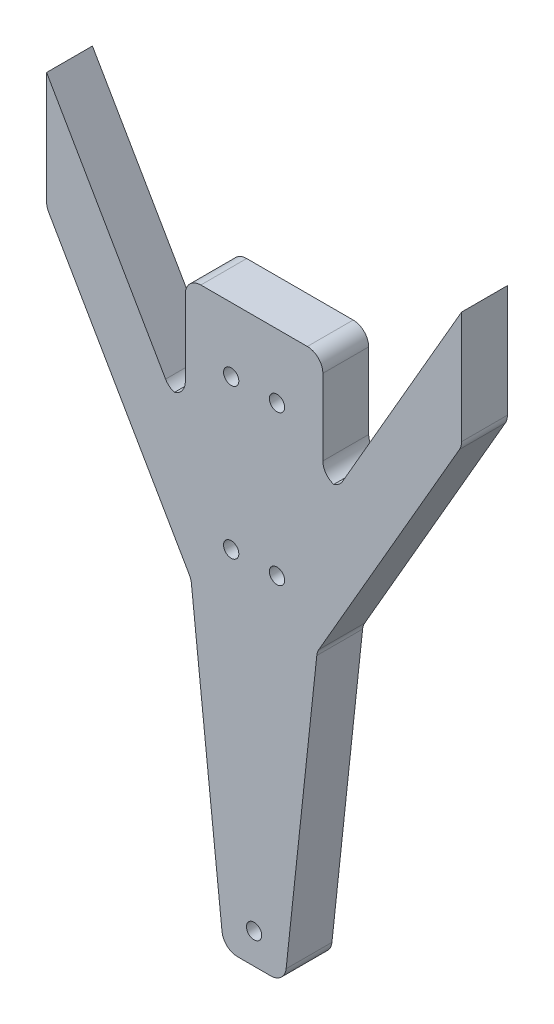
ISO-10303-21;
HEADER;
FILE_DESCRIPTION(('STEP AP214'),'2;1');
FILE_NAME('part.step','',(''),(''),'','','');
FILE_SCHEMA(('AUTOMOTIVE_DESIGN { 1 0 10303 214 1 1 1 1 }'));
ENDSEC;
DATA;
#1=APPLICATION_CONTEXT('core data for automotive mechanical design processes');
#2=APPLICATION_PROTOCOL_DEFINITION('international standard','automotive_design',2000,#1);
#3=PRODUCT_CONTEXT('',#1,'mechanical');
#4=PRODUCT('Part','Part','',(#3));
#5=PRODUCT_RELATED_PRODUCT_CATEGORY('part','',(#4));
#6=PRODUCT_DEFINITION_FORMATION('','',#4);
#7=PRODUCT_DEFINITION_CONTEXT('part definition',#1,'design');
#8=PRODUCT_DEFINITION('design','',#6,#7);
#9=PRODUCT_DEFINITION_SHAPE('','',#8);
#10=(LENGTH_UNIT() NAMED_UNIT(*) SI_UNIT(.MILLI.,.METRE.));
#11=(NAMED_UNIT(*) PLANE_ANGLE_UNIT() SI_UNIT($,.RADIAN.));
#12=(NAMED_UNIT(*) SI_UNIT($,.STERADIAN.) SOLID_ANGLE_UNIT());
#13=UNCERTAINTY_MEASURE_WITH_UNIT(LENGTH_MEASURE(1.E-05),#10,'distance_accuracy_value','');
#14=(GEOMETRIC_REPRESENTATION_CONTEXT(3) GLOBAL_UNCERTAINTY_ASSIGNED_CONTEXT((#13)) GLOBAL_UNIT_ASSIGNED_CONTEXT((#10,
#11,#12)) REPRESENTATION_CONTEXT('',''));
#15=CARTESIAN_POINT('',(0.,0.,0.));
#16=DIRECTION('',(0.,0.,1.));
#17=DIRECTION('',(1.,0.,0.));
#18=AXIS2_PLACEMENT_3D('',#15,#16,#17);
#19=CARTESIAN_POINT('',(7.50000000000001,64.,0.));
#20=DIRECTION('',(0.,0.,-1.));
#21=DIRECTION('',(-1.,0.,0.));
#22=AXIS2_PLACEMENT_3D('',#19,#20,#21);
#23=CYLINDRICAL_SURFACE('',#22,2.5);
#24=CARTESIAN_POINT('',(7.50000000000001,64.,15.));
#25=DIRECTION('',(0.,0.,-1.));
#26=DIRECTION('',(-1.,0.,0.));
#27=AXIS2_PLACEMENT_3D('',#24,#25,#26);
#28=CIRCLE('',#27,2.5);
#29=CARTESIAN_POINT('',(5.00000000000002,64.,15.));
#30=VERTEX_POINT('',#29);
#31=EDGE_CURVE('E501',#30,#30,#28,.T.);
#32=ORIENTED_EDGE('',*,*,#31,.F.);
#33=EDGE_LOOP('',(#32));
#34=FACE_BOUND('',#33,.T.);
#35=CARTESIAN_POINT('',(7.50000000000001,64.,5.));
#36=DIRECTION('',(0.,0.,-1.));
#37=DIRECTION('',(-1.,0.,0.));
#38=AXIS2_PLACEMENT_3D('',#35,#36,#37);
#39=CIRCLE('',#38,2.5);
#40=CARTESIAN_POINT('',(5.00000000000002,64.,5.));
#41=VERTEX_POINT('',#40);
#42=EDGE_CURVE('E45',#41,#41,#39,.F.);
#43=ORIENTED_EDGE('',*,*,#42,.F.);
#44=EDGE_LOOP('',(#43));
#45=FACE_BOUND('',#44,.T.);
#46=ADVANCED_FACE('F41',(#34,#45),#23,.F.);
#47=CARTESIAN_POINT('',(-7.49999999999998,64.,0.));
#48=DIRECTION('',(0.,0.,-1.));
#49=DIRECTION('',(-1.,0.,0.));
#50=AXIS2_PLACEMENT_3D('',#47,#48,#49);
#51=CYLINDRICAL_SURFACE('',#50,2.5);
#52=CARTESIAN_POINT('',(-7.49999999999998,64.,15.));
#53=DIRECTION('',(0.,0.,-1.));
#54=DIRECTION('',(-1.,0.,0.));
#55=AXIS2_PLACEMENT_3D('',#52,#53,#54);
#56=CIRCLE('',#55,2.5);
#57=CARTESIAN_POINT('',(-9.99999999999998,64.,15.));
#58=VERTEX_POINT('',#57);
#59=EDGE_CURVE('E480',#58,#58,#56,.T.);
#60=ORIENTED_EDGE('',*,*,#59,.F.);
#61=EDGE_LOOP('',(#60));
#62=FACE_BOUND('',#61,.T.);
#63=CARTESIAN_POINT('',(-7.49999999999998,64.,5.));
#64=DIRECTION('',(0.,0.,-1.));
#65=DIRECTION('',(-1.,0.,0.));
#66=AXIS2_PLACEMENT_3D('',#63,#64,#65);
#67=CIRCLE('',#66,2.5);
#68=CARTESIAN_POINT('',(-9.99999999999998,64.,5.));
#69=VERTEX_POINT('',#68);
#70=EDGE_CURVE('E471',#69,#69,#67,.F.);
#71=ORIENTED_EDGE('',*,*,#70,.F.);
#72=EDGE_LOOP('',(#71));
#73=FACE_BOUND('',#72,.T.);
#74=ADVANCED_FACE('F561',(#62,#73),#51,.F.);
#75=CARTESIAN_POINT('',(0.,0.,15.));
#76=DIRECTION('',(0.,0.,1.));
#77=DIRECTION('',(1.,0.,0.));
#78=AXIS2_PLACEMENT_3D('',#75,#76,#77);
#79=PLANE('',#78);
#80=DIRECTION('',(-1.,0.,0.));
#81=VECTOR('',#80,1.);
#82=CARTESIAN_POINT('',(-22.5104682033564,85.0000000000001,15.));
#83=LINE('',#82,#81);
#84=CARTESIAN_POINT('',(17.4304682033558,85.0000000000001,15.));
#85=VERTEX_POINT('',#84);
#86=CARTESIAN_POINT('',(-17.4304682033564,85.0000000000001,15.));
#87=VERTEX_POINT('',#86);
#88=EDGE_CURVE('E269',#85,#87,#83,.T.);
#89=ORIENTED_EDGE('',*,*,#88,.T.);
#90=CARTESIAN_POINT('',(-17.4304682033564,79.9200000000001,15.));
#91=DIRECTION('',(0.,0.,1.));
#92=DIRECTION('',(1.,0.,0.));
#93=AXIS2_PLACEMENT_3D('',#90,#91,#92);
#94=CIRCLE('',#93,5.08);
#95=CARTESIAN_POINT('',(-22.5104682033564,79.9200000000001,15.));
#96=VERTEX_POINT('',#95);
#97=EDGE_CURVE('E381',#87,#96,#94,.T.);
#98=ORIENTED_EDGE('',*,*,#97,.T.);
#99=DIRECTION('',(0.,-1.,0.));
#100=VECTOR('',#99,1.);
#101=CARTESIAN_POINT('',(-22.5104682033564,50.0000000000001,15.));
#102=LINE('',#101,#100);
#103=CARTESIAN_POINT('',(-22.5104682033564,55.0800000000001,15.));
#104=VERTEX_POINT('',#103);
#105=EDGE_CURVE('E272',#96,#104,#102,.T.);
#106=ORIENTED_EDGE('',*,*,#105,.T.);
#107=CARTESIAN_POINT('',(-27.5904682033564,55.0800000000001,15.));
#108=DIRECTION('',(0.,0.,1.));
#109=DIRECTION('',(1.,0.,0.));
#110=AXIS2_PLACEMENT_3D('',#107,#108,#109);
#111=CIRCLE('',#110,5.08);
#112=CARTESIAN_POINT('',(-26.0839985196147,50.2285106315724,15.));
#113=VERTEX_POINT('',#112);
#114=EDGE_CURVE('E59',#104,#113,#111,.F.);
#115=ORIENTED_EDGE('',*,*,#114,.T.);
#116=CARTESIAN_POINT('',(-24.5775288358731,55.0800000000001,15.));
#117=DIRECTION('',(0.,0.,1.));
#118=DIRECTION('',(1.,0.,0.));
#119=AXIS2_PLACEMENT_3D('',#116,#117,#118);
#120=CIRCLE('',#119,5.08);
#121=CARTESIAN_POINT('',(-28.976937887098,52.5400000000001,15.));
#122=VERTEX_POINT('',#121);
#123=EDGE_CURVE('E213',#113,#122,#120,.F.);
#124=ORIENTED_EDGE('',*,*,#123,.T.);
#125=DIRECTION('',(-0.500000000000004,0.866025403784436,0.));
#126=VECTOR('',#125,1.);
#127=CARTESIAN_POINT('',(-67.9249870466306,120.,15.));
#128=LINE('',#127,#126);
#129=CARTESIAN_POINT('',(-67.9249870466306,120.,15.));
#130=VERTEX_POINT('',#129);
#131=EDGE_CURVE('E204',#122,#130,#128,.T.);
#132=ORIENTED_EDGE('',*,*,#131,.T.);
#133=DIRECTION('',(0.,-1.,0.));
#134=VECTOR('',#133,1.);
#135=CARTESIAN_POINT('',(-67.9249870466306,120.,15.));
#136=LINE('',#135,#134);
#137=CARTESIAN_POINT('',(-67.9249870466306,83.261181897551,15.));
#138=VERTEX_POINT('',#137);
#139=EDGE_CURVE('E210',#130,#138,#136,.T.);
#140=ORIENTED_EDGE('',*,*,#139,.T.);
#141=CARTESIAN_POINT('',(-62.8449870466306,83.261181897551,15.));
#142=DIRECTION('',(0.,0.,1.));
#143=DIRECTION('',(1.,0.,0.));
#144=AXIS2_PLACEMENT_3D('',#141,#142,#143);
#145=CIRCLE('',#144,5.08);
#146=CARTESIAN_POINT('',(-67.2443960978555,80.721181897551,15.));
#147=VERTEX_POINT('',#146);
#148=EDGE_CURVE('E372',#138,#147,#145,.T.);
#149=ORIENTED_EDGE('',*,*,#148,.T.);
#150=DIRECTION('',(0.500000000000004,-0.866025403784436,0.));
#151=VECTOR('',#150,1.);
#152=CARTESIAN_POINT('',(-20.6399999999992,0.,15.));
#153=LINE('',#152,#151);
#154=CARTESIAN_POINT('',(-21.1773959945488,0.930797166343919,15.));
#155=VERTEX_POINT('',#154);
#156=EDGE_CURVE('E235',#147,#155,#153,.T.);
#157=ORIENTED_EDGE('',*,*,#156,.T.);
#158=CARTESIAN_POINT('',(-25.5768050457737,-1.60920283365611,15.));
#159=DIRECTION('',(0.,0.,1.));
#160=DIRECTION('',(1.,0.,0.));
#161=AXIS2_PLACEMENT_3D('',#158,#159,#160);
#162=CIRCLE('',#161,5.08);
#163=CARTESIAN_POINT('',(-20.525642132359,-1.06869083365617,15.));
#164=VERTEX_POINT('',#163);
#165=EDGE_CURVE('E11',#155,#164,#162,.F.);
#166=ORIENTED_EDGE('',*,*,#165,.T.);
#167=DIRECTION('',(0.106399999999992,-0.994323408152499,0.));
#168=VECTOR('',#167,1.);
#169=CARTESIAN_POINT('',(-10.,-99.4323408152499,15.));
#170=LINE('',#169,#168);
#171=CARTESIAN_POINT('',(-10.4857589786581,-94.8928528152499,15.));
#172=VERTEX_POINT('',#171);
#173=EDGE_CURVE('E239',#164,#172,#170,.T.);
#174=ORIENTED_EDGE('',*,*,#173,.T.);
#175=CARTESIAN_POINT('',(-5.43459606524337,-94.3523408152499,15.));
#176=DIRECTION('',(0.,0.,1.));
#177=DIRECTION('',(1.,0.,0.));
#178=AXIS2_PLACEMENT_3D('',#175,#176,#177);
#179=CIRCLE('',#178,5.08);
#180=CARTESIAN_POINT('',(-5.43459606524337,-99.4323408152499,15.));
#181=VERTEX_POINT('',#180);
#182=EDGE_CURVE('E369',#172,#181,#179,.T.);
#183=ORIENTED_EDGE('',*,*,#182,.T.);
#184=DIRECTION('',(1.,0.,0.));
#185=VECTOR('',#184,1.);
#186=CARTESIAN_POINT('',(10.,-99.4323408152499,15.));
#187=LINE('',#186,#185);
#188=CARTESIAN_POINT('',(5.43459606524337,-99.4323408152499,15.));
#189=VERTEX_POINT('',#188);
#190=EDGE_CURVE('E246',#181,#189,#187,.T.);
#191=ORIENTED_EDGE('',*,*,#190,.T.);
#192=CARTESIAN_POINT('',(5.43459606524337,-94.3523408152499,15.));
#193=DIRECTION('',(0.,0.,1.));
#194=DIRECTION('',(1.,0.,0.));
#195=AXIS2_PLACEMENT_3D('',#192,#193,#194);
#196=CIRCLE('',#195,5.08);
#197=CARTESIAN_POINT('',(10.4857589786581,-94.8928528152499,15.));
#198=VERTEX_POINT('',#197);
#199=EDGE_CURVE('E366',#189,#198,#196,.T.);
#200=ORIENTED_EDGE('',*,*,#199,.T.);
#201=DIRECTION('',(0.106399999999992,0.994323408152499,0.));
#202=VECTOR('',#201,1.);
#203=CARTESIAN_POINT('',(20.6399999999992,0.,15.));
#204=LINE('',#203,#202);
#205=CARTESIAN_POINT('',(20.5256421323591,-1.06869083365608,15.));
#206=VERTEX_POINT('',#205);
#207=EDGE_CURVE('E250',#198,#206,#204,.T.);
#208=ORIENTED_EDGE('',*,*,#207,.T.);
#209=CARTESIAN_POINT('',(25.5768050457738,-1.60920283365604,15.));
#210=DIRECTION('',(0.,0.,1.));
#211=DIRECTION('',(1.,0.,0.));
#212=AXIS2_PLACEMENT_3D('',#209,#210,#211);
#213=CIRCLE('',#212,5.08);
#214=CARTESIAN_POINT('',(21.1773959945488,0.93079716634395,15.));
#215=VERTEX_POINT('',#214);
#216=EDGE_CURVE('E449',#206,#215,#213,.F.);
#217=ORIENTED_EDGE('',*,*,#216,.T.);
#218=DIRECTION('',(0.499999999999998,0.86602540378444,0.));
#219=VECTOR('',#218,1.);
#220=CARTESIAN_POINT('',(67.9249870466299,81.9000000000008,15.));
#221=LINE('',#220,#219);
#222=CARTESIAN_POINT('',(67.2443960978548,80.7211818975509,15.));
#223=VERTEX_POINT('',#222);
#224=EDGE_CURVE('E254',#215,#223,#221,.T.);
#225=ORIENTED_EDGE('',*,*,#224,.T.);
#226=CARTESIAN_POINT('',(62.8449870466298,83.2611818975509,15.));
#227=DIRECTION('',(0.,0.,1.));
#228=DIRECTION('',(1.,0.,0.));
#229=AXIS2_PLACEMENT_3D('',#226,#227,#228);
#230=CIRCLE('',#229,5.08);
#231=CARTESIAN_POINT('',(67.9249870466299,83.2611818975509,15.));
#232=VERTEX_POINT('',#231);
#233=EDGE_CURVE('E375',#223,#232,#230,.T.);
#234=ORIENTED_EDGE('',*,*,#233,.T.);
#235=DIRECTION('',(0.,1.,0.));
#236=VECTOR('',#235,1.);
#237=CARTESIAN_POINT('',(67.9249870466299,120.,15.));
#238=LINE('',#237,#236);
#239=CARTESIAN_POINT('',(67.9249870466299,120.,15.));
#240=VERTEX_POINT('',#239);
#241=EDGE_CURVE('E258',#232,#240,#238,.T.);
#242=ORIENTED_EDGE('',*,*,#241,.T.);
#243=DIRECTION('',(-0.499999999999999,-0.866025403784439,0.));
#244=VECTOR('',#243,1.);
#245=CARTESIAN_POINT('',(27.5104682033558,49.9999999999993,15.));
#246=LINE('',#245,#244);
#247=CARTESIAN_POINT('',(28.9769378870974,52.5399999999993,15.));
#248=VERTEX_POINT('',#247);
#249=EDGE_CURVE('E261',#240,#248,#246,.T.);
#250=ORIENTED_EDGE('',*,*,#249,.T.);
#251=CARTESIAN_POINT('',(24.5775288358725,55.0799999999993,15.));
#252=DIRECTION('',(0.,0.,1.));
#253=DIRECTION('',(1.,0.,0.));
#254=AXIS2_PLACEMENT_3D('',#251,#252,#253);
#255=CIRCLE('',#254,5.08);
#256=CARTESIAN_POINT('',(26.0839985196141,50.2285106315716,15.));
#257=VERTEX_POINT('',#256);
#258=EDGE_CURVE('E428',#248,#257,#255,.F.);
#259=ORIENTED_EDGE('',*,*,#258,.T.);
#260=CARTESIAN_POINT('',(27.5904682033558,55.0799999999993,15.));
#261=DIRECTION('',(0.,0.,1.));
#262=DIRECTION('',(1.,0.,0.));
#263=AXIS2_PLACEMENT_3D('',#260,#261,#262);
#264=CIRCLE('',#263,5.08);
#265=CARTESIAN_POINT('',(22.5104682033558,55.0799999999993,15.));
#266=VERTEX_POINT('',#265);
#267=EDGE_CURVE('E434',#257,#266,#264,.F.);
#268=ORIENTED_EDGE('',*,*,#267,.T.);
#269=DIRECTION('',(0.,1.,0.));
#270=VECTOR('',#269,1.);
#271=CARTESIAN_POINT('',(22.5104682033558,85.0000000000001,15.));
#272=LINE('',#271,#270);
#273=CARTESIAN_POINT('',(22.5104682033558,79.9200000000001,15.));
#274=VERTEX_POINT('',#273);
#275=EDGE_CURVE('E265',#266,#274,#272,.T.);
#276=ORIENTED_EDGE('',*,*,#275,.T.);
#277=CARTESIAN_POINT('',(17.4304682033558,79.9200000000001,15.));
#278=DIRECTION('',(0.,0.,1.));
#279=DIRECTION('',(1.,0.,0.));
#280=AXIS2_PLACEMENT_3D('',#277,#278,#279);
#281=CIRCLE('',#280,5.08);
#282=EDGE_CURVE('E378',#274,#85,#281,.T.);
#283=ORIENTED_EDGE('',*,*,#282,.T.);
#284=EDGE_LOOP('',(#89,#98,#106,#115,#124,#132,#140,#149,#157,#166,#174,#183,#191,#200,#208,
#217,#225,#234,#242,#250,#259,#268,#276,#283));
#285=FACE_BOUND('',#284,.T.);
#286=CARTESIAN_POINT('',(7.5,15.,15.));
#287=DIRECTION('',(0.,0.,-1.));
#288=DIRECTION('',(-1.,0.,0.));
#289=AXIS2_PLACEMENT_3D('',#286,#287,#288);
#290=CIRCLE('',#289,2.5);
#291=CARTESIAN_POINT('',(5.,15.,15.));
#292=VERTEX_POINT('',#291);
#293=EDGE_CURVE('E461',#292,#292,#290,.T.);
#294=ORIENTED_EDGE('',*,*,#293,.T.);
#295=EDGE_LOOP('',(#294));
#296=FACE_BOUND('',#295,.T.);
#297=CARTESIAN_POINT('',(-7.5,15.,15.));
#298=DIRECTION('',(0.,0.,-1.));
#299=DIRECTION('',(-1.,0.,0.));
#300=AXIS2_PLACEMENT_3D('',#297,#298,#299);
#301=CIRCLE('',#300,2.5);
#302=CARTESIAN_POINT('',(-9.99999999999999,15.,15.));
#303=VERTEX_POINT('',#302);
#304=EDGE_CURVE('E470',#303,#303,#301,.T.);
#305=ORIENTED_EDGE('',*,*,#304,.T.);
#306=EDGE_LOOP('',(#305));
#307=FACE_BOUND('',#306,.T.);
#308=CARTESIAN_POINT('',(0.,-89.4323408152499,15.));
#309=DIRECTION('',(0.,0.,1.));
#310=DIRECTION('',(1.,0.,0.));
#311=AXIS2_PLACEMENT_3D('',#308,#309,#310);
#312=CIRCLE('',#311,2.5);
#313=CARTESIAN_POINT('',(2.5,-89.4323408152499,15.));
#314=VERTEX_POINT('',#313);
#315=EDGE_CURVE('E505',#314,#314,#312,.T.);
#316=ORIENTED_EDGE('',*,*,#315,.F.);
#317=EDGE_LOOP('',(#316));
#318=FACE_BOUND('',#317,.T.);
#319=ORIENTED_EDGE('',*,*,#31,.T.);
#320=EDGE_LOOP('',(#319));
#321=FACE_BOUND('',#320,.T.);
#322=ORIENTED_EDGE('',*,*,#59,.T.);
#323=EDGE_LOOP('',(#322));
#324=FACE_BOUND('',#323,.T.);
#325=ADVANCED_FACE('F207',(#285,#296,#307,#318,#321,#324),#79,.T.);
#326=CARTESIAN_POINT('',(0.,0.,0.));
#327=DIRECTION('',(0.,0.,1.));
#328=DIRECTION('',(1.,0.,0.));
#329=AXIS2_PLACEMENT_3D('',#326,#327,#328);
#330=PLANE('',#329);
#331=CARTESIAN_POINT('',(7.50000000000001,64.,0.));
#332=DIRECTION('',(0.,0.,-1.));
#333=DIRECTION('',(-1.,0.,0.));
#334=AXIS2_PLACEMENT_3D('',#331,#332,#333);
#335=CIRCLE('',#334,5.5);
#336=CARTESIAN_POINT('',(2.00000000000001,64.,0.));
#337=VERTEX_POINT('',#336);
#338=EDGE_CURVE('E482',#337,#337,#335,.T.);
#339=ORIENTED_EDGE('',*,*,#338,.F.);
#340=EDGE_LOOP('',(#339));
#341=FACE_BOUND('',#340,.T.);
#342=CARTESIAN_POINT('',(-7.49999999999998,64.,0.));
#343=DIRECTION('',(0.,0.,-1.));
#344=DIRECTION('',(-1.,0.,0.));
#345=AXIS2_PLACEMENT_3D('',#342,#343,#344);
#346=CIRCLE('',#345,5.5);
#347=CARTESIAN_POINT('',(-13.,64.,0.));
#348=VERTEX_POINT('',#347);
#349=EDGE_CURVE('E494',#348,#348,#346,.T.);
#350=ORIENTED_EDGE('',*,*,#349,.F.);
#351=EDGE_LOOP('',(#350));
#352=FACE_BOUND('',#351,.T.);
#353=CARTESIAN_POINT('',(0.,-89.4323408152499,0.));
#354=DIRECTION('',(0.,0.,1.));
#355=DIRECTION('',(1.,0.,0.));
#356=AXIS2_PLACEMENT_3D('',#353,#354,#355);
#357=CIRCLE('',#356,2.5);
#358=CARTESIAN_POINT('',(2.5,-89.4323408152499,0.));
#359=VERTEX_POINT('',#358);
#360=EDGE_CURVE('E506',#359,#359,#357,.T.);
#361=ORIENTED_EDGE('',*,*,#360,.T.);
#362=EDGE_LOOP('',(#361));
#363=FACE_BOUND('',#362,.T.);
#364=CARTESIAN_POINT('',(7.5,15.,0.));
#365=DIRECTION('',(0.,0.,-1.));
#366=DIRECTION('',(-1.,0.,0.));
#367=AXIS2_PLACEMENT_3D('',#364,#365,#366);
#368=CIRCLE('',#367,5.5);
#369=CARTESIAN_POINT('',(2.,15.,0.));
#370=VERTEX_POINT('',#369);
#371=EDGE_CURVE('E517',#370,#370,#368,.T.);
#372=ORIENTED_EDGE('',*,*,#371,.F.);
#373=EDGE_LOOP('',(#372));
#374=FACE_BOUND('',#373,.T.);
#375=CARTESIAN_POINT('',(-7.5,15.,0.));
#376=DIRECTION('',(0.,0.,-1.));
#377=DIRECTION('',(-1.,0.,0.));
#378=AXIS2_PLACEMENT_3D('',#375,#376,#377);
#379=CIRCLE('',#378,5.5);
#380=CARTESIAN_POINT('',(-13.,15.,0.));
#381=VERTEX_POINT('',#380);
#382=EDGE_CURVE('E510',#381,#381,#379,.T.);
#383=ORIENTED_EDGE('',*,*,#382,.F.);
#384=EDGE_LOOP('',(#383));
#385=FACE_BOUND('',#384,.T.);
#386=DIRECTION('',(0.,-1.,0.));
#387=VECTOR('',#386,1.);
#388=CARTESIAN_POINT('',(-22.5104682033564,50.0000000000001,0.));
#389=LINE('',#388,#387);
#390=CARTESIAN_POINT('',(-22.5104682033564,79.9200000000001,0.));
#391=VERTEX_POINT('',#390);
#392=CARTESIAN_POINT('',(-22.5104682033564,55.0800000000001,0.));
#393=VERTEX_POINT('',#392);
#394=EDGE_CURVE('E218',#391,#393,#389,.T.);
#395=ORIENTED_EDGE('',*,*,#394,.F.);
#396=CARTESIAN_POINT('',(-17.4304682033564,79.9200000000001,0.));
#397=DIRECTION('',(0.,0.,1.));
#398=DIRECTION('',(1.,0.,0.));
#399=AXIS2_PLACEMENT_3D('',#396,#397,#398);
#400=CIRCLE('',#399,5.08);
#401=CARTESIAN_POINT('',(-17.4304682033564,85.0000000000001,0.));
#402=VERTEX_POINT('',#401);
#403=EDGE_CURVE('E356',#391,#402,#400,.F.);
#404=ORIENTED_EDGE('',*,*,#403,.T.);
#405=DIRECTION('',(-1.,0.,0.));
#406=VECTOR('',#405,1.);
#407=CARTESIAN_POINT('',(-22.5104682033564,85.0000000000001,0.));
#408=LINE('',#407,#406);
#409=CARTESIAN_POINT('',(17.4304682033558,85.0000000000001,0.));
#410=VERTEX_POINT('',#409);
#411=EDGE_CURVE('E312',#410,#402,#408,.T.);
#412=ORIENTED_EDGE('',*,*,#411,.F.);
#413=CARTESIAN_POINT('',(17.4304682033558,79.9200000000001,0.));
#414=DIRECTION('',(0.,0.,1.));
#415=DIRECTION('',(1.,0.,0.));
#416=AXIS2_PLACEMENT_3D('',#413,#414,#415);
#417=CIRCLE('',#416,5.08);
#418=CARTESIAN_POINT('',(22.5104682033558,79.9200000000001,0.));
#419=VERTEX_POINT('',#418);
#420=EDGE_CURVE('E353',#410,#419,#417,.F.);
#421=ORIENTED_EDGE('',*,*,#420,.T.);
#422=DIRECTION('',(0.,1.,0.));
#423=VECTOR('',#422,1.);
#424=CARTESIAN_POINT('',(22.5104682033558,85.0000000000001,0.));
#425=LINE('',#424,#423);
#426=CARTESIAN_POINT('',(22.5104682033558,55.0799999999993,0.));
#427=VERTEX_POINT('',#426);
#428=EDGE_CURVE('E308',#427,#419,#425,.T.);
#429=ORIENTED_EDGE('',*,*,#428,.F.);
#430=CARTESIAN_POINT('',(27.5904682033558,55.0799999999993,0.));
#431=DIRECTION('',(0.,0.,1.));
#432=DIRECTION('',(1.,0.,0.));
#433=AXIS2_PLACEMENT_3D('',#430,#431,#432);
#434=CIRCLE('',#433,5.08);
#435=CARTESIAN_POINT('',(26.0839985196141,50.2285106315716,0.));
#436=VERTEX_POINT('',#435);
#437=EDGE_CURVE('E431',#427,#436,#434,.T.);
#438=ORIENTED_EDGE('',*,*,#437,.T.);
#439=CARTESIAN_POINT('',(24.5775288358725,55.0799999999993,0.));
#440=DIRECTION('',(0.,0.,1.));
#441=DIRECTION('',(1.,0.,0.));
#442=AXIS2_PLACEMENT_3D('',#439,#440,#441);
#443=CIRCLE('',#442,5.08);
#444=CARTESIAN_POINT('',(28.9769378870974,52.5399999999993,0.));
#445=VERTEX_POINT('',#444);
#446=EDGE_CURVE('E425',#436,#445,#443,.T.);
#447=ORIENTED_EDGE('',*,*,#446,.T.);
#448=DIRECTION('',(-0.499999999999999,-0.866025403784439,0.));
#449=VECTOR('',#448,1.);
#450=CARTESIAN_POINT('',(27.5104682033558,49.9999999999993,0.));
#451=LINE('',#450,#449);
#452=CARTESIAN_POINT('',(67.9249870466299,120.,0.));
#453=VERTEX_POINT('',#452);
#454=EDGE_CURVE('E304',#453,#445,#451,.T.);
#455=ORIENTED_EDGE('',*,*,#454,.F.);
#456=DIRECTION('',(0.,1.,0.));
#457=VECTOR('',#456,1.);
#458=CARTESIAN_POINT('',(67.9249870466299,120.,0.));
#459=LINE('',#458,#457);
#460=CARTESIAN_POINT('',(67.9249870466299,83.2611818975509,0.));
#461=VERTEX_POINT('',#460);
#462=EDGE_CURVE('E301',#461,#453,#459,.T.);
#463=ORIENTED_EDGE('',*,*,#462,.F.);
#464=CARTESIAN_POINT('',(62.8449870466298,83.2611818975509,0.));
#465=DIRECTION('',(0.,0.,1.));
#466=DIRECTION('',(1.,0.,0.));
#467=AXIS2_PLACEMENT_3D('',#464,#465,#466);
#468=CIRCLE('',#467,5.08);
#469=CARTESIAN_POINT('',(67.2443960978548,80.7211818975509,0.));
#470=VERTEX_POINT('',#469);
#471=EDGE_CURVE('E350',#461,#470,#468,.F.);
#472=ORIENTED_EDGE('',*,*,#471,.T.);
#473=DIRECTION('',(0.499999999999998,0.86602540378444,0.));
#474=VECTOR('',#473,1.);
#475=CARTESIAN_POINT('',(67.9249870466299,81.9000000000008,0.));
#476=LINE('',#475,#474);
#477=CARTESIAN_POINT('',(21.1773959945488,0.93079716634395,0.));
#478=VERTEX_POINT('',#477);
#479=EDGE_CURVE('E297',#478,#470,#476,.T.);
#480=ORIENTED_EDGE('',*,*,#479,.F.);
#481=CARTESIAN_POINT('',(25.5768050457738,-1.60920283365604,0.));
#482=DIRECTION('',(0.,0.,1.));
#483=DIRECTION('',(1.,0.,0.));
#484=AXIS2_PLACEMENT_3D('',#481,#482,#483);
#485=CIRCLE('',#484,5.08);
#486=CARTESIAN_POINT('',(20.5256421323591,-1.06869083365608,0.));
#487=VERTEX_POINT('',#486);
#488=EDGE_CURVE('E446',#478,#487,#485,.T.);
#489=ORIENTED_EDGE('',*,*,#488,.T.);
#490=DIRECTION('',(0.106399999999992,0.994323408152499,0.));
#491=VECTOR('',#490,1.);
#492=CARTESIAN_POINT('',(20.6399999999992,0.,0.));
#493=LINE('',#492,#491);
#494=CARTESIAN_POINT('',(10.4857589786581,-94.8928528152499,0.));
#495=VERTEX_POINT('',#494);
#496=EDGE_CURVE('E293',#495,#487,#493,.T.);
#497=ORIENTED_EDGE('',*,*,#496,.F.);
#498=CARTESIAN_POINT('',(5.43459606524337,-94.3523408152499,0.));
#499=DIRECTION('',(0.,0.,1.));
#500=DIRECTION('',(1.,0.,0.));
#501=AXIS2_PLACEMENT_3D('',#498,#499,#500);
#502=CIRCLE('',#501,5.08);
#503=CARTESIAN_POINT('',(5.43459606524337,-99.4323408152499,0.));
#504=VERTEX_POINT('',#503);
#505=EDGE_CURVE('E341',#495,#504,#502,.F.);
#506=ORIENTED_EDGE('',*,*,#505,.T.);
#507=DIRECTION('',(1.,0.,0.));
#508=VECTOR('',#507,1.);
#509=CARTESIAN_POINT('',(10.,-99.4323408152499,0.));
#510=LINE('',#509,#508);
#511=CARTESIAN_POINT('',(-5.43459606524337,-99.4323408152499,0.));
#512=VERTEX_POINT('',#511);
#513=EDGE_CURVE('E289',#512,#504,#510,.T.);
#514=ORIENTED_EDGE('',*,*,#513,.F.);
#515=CARTESIAN_POINT('',(-5.43459606524337,-94.3523408152499,0.));
#516=DIRECTION('',(0.,0.,1.));
#517=DIRECTION('',(1.,0.,0.));
#518=AXIS2_PLACEMENT_3D('',#515,#516,#517);
#519=CIRCLE('',#518,5.08);
#520=CARTESIAN_POINT('',(-10.4857589786581,-94.8928528152499,0.));
#521=VERTEX_POINT('',#520);
#522=EDGE_CURVE('E344',#512,#521,#519,.F.);
#523=ORIENTED_EDGE('',*,*,#522,.T.);
#524=DIRECTION('',(0.106399999999992,-0.994323408152499,0.));
#525=VECTOR('',#524,1.);
#526=CARTESIAN_POINT('',(-10.,-99.4323408152499,0.));
#527=LINE('',#526,#525);
#528=CARTESIAN_POINT('',(-20.525642132359,-1.06869083365617,0.));
#529=VERTEX_POINT('',#528);
#530=EDGE_CURVE('E285',#529,#521,#527,.T.);
#531=ORIENTED_EDGE('',*,*,#530,.F.);
#532=CARTESIAN_POINT('',(-25.5768050457737,-1.60920283365611,0.));
#533=DIRECTION('',(0.,0.,1.));
#534=DIRECTION('',(1.,0.,0.));
#535=AXIS2_PLACEMENT_3D('',#532,#533,#534);
#536=CIRCLE('',#535,5.08);
#537=CARTESIAN_POINT('',(-21.1773959945488,0.930797166343919,0.));
#538=VERTEX_POINT('',#537);
#539=EDGE_CURVE('E51',#529,#538,#536,.T.);
#540=ORIENTED_EDGE('',*,*,#539,.T.);
#541=DIRECTION('',(0.500000000000004,-0.866025403784436,0.));
#542=VECTOR('',#541,1.);
#543=CARTESIAN_POINT('',(-20.6399999999992,0.,0.));
#544=LINE('',#543,#542);
#545=CARTESIAN_POINT('',(-67.2443960978555,80.721181897551,0.));
#546=VERTEX_POINT('',#545);
#547=EDGE_CURVE('E281',#546,#538,#544,.T.);
#548=ORIENTED_EDGE('',*,*,#547,.F.);
#549=CARTESIAN_POINT('',(-62.8449870466306,83.261181897551,0.));
#550=DIRECTION('',(0.,0.,1.));
#551=DIRECTION('',(1.,0.,0.));
#552=AXIS2_PLACEMENT_3D('',#549,#550,#551);
#553=CIRCLE('',#552,5.08);
#554=CARTESIAN_POINT('',(-67.9249870466306,83.261181897551,0.));
#555=VERTEX_POINT('',#554);
#556=EDGE_CURVE('E347',#546,#555,#553,.F.);
#557=ORIENTED_EDGE('',*,*,#556,.T.);
#558=DIRECTION('',(0.,-1.,0.));
#559=VECTOR('',#558,1.);
#560=CARTESIAN_POINT('',(-67.9249870466306,120.,0.));
#561=LINE('',#560,#559);
#562=CARTESIAN_POINT('',(-67.9249870466306,120.,0.));
#563=VERTEX_POINT('',#562);
#564=EDGE_CURVE('E277',#563,#555,#561,.T.);
#565=ORIENTED_EDGE('',*,*,#564,.F.);
#566=DIRECTION('',(-0.500000000000004,0.866025403784436,0.));
#567=VECTOR('',#566,1.);
#568=CARTESIAN_POINT('',(-67.9249870466306,120.,0.));
#569=LINE('',#568,#567);
#570=CARTESIAN_POINT('',(-28.976937887098,52.5400000000001,0.));
#571=VERTEX_POINT('',#570);
#572=EDGE_CURVE('E223',#571,#563,#569,.T.);
#573=ORIENTED_EDGE('',*,*,#572,.F.);
#574=CARTESIAN_POINT('',(-24.5775288358731,55.0800000000001,0.));
#575=DIRECTION('',(0.,0.,1.));
#576=DIRECTION('',(1.,0.,0.));
#577=AXIS2_PLACEMENT_3D('',#574,#575,#576);
#578=CIRCLE('',#577,5.08);
#579=CARTESIAN_POINT('',(-26.0839985196147,50.2285106315724,0.));
#580=VERTEX_POINT('',#579);
#581=EDGE_CURVE('E67',#571,#580,#578,.T.);
#582=ORIENTED_EDGE('',*,*,#581,.T.);
#583=CARTESIAN_POINT('',(-27.5904682033564,55.0800000000001,0.));
#584=DIRECTION('',(0.,0.,1.));
#585=DIRECTION('',(1.,0.,0.));
#586=AXIS2_PLACEMENT_3D('',#583,#584,#585);
#587=CIRCLE('',#586,5.08);
#588=EDGE_CURVE('E441',#580,#393,#587,.T.);
#589=ORIENTED_EDGE('',*,*,#588,.T.);
#590=EDGE_LOOP('',(#395,#404,#412,#421,#429,#438,#447,#455,#463,#472,#480,#489,#497,#506,#514,
#523,#531,#540,#548,#557,#565,#573,#582,#589));
#591=FACE_BOUND('',#590,.T.);
#592=ADVANCED_FACE('F539',(#341,#352,#363,#374,#385,#591),#330,.F.);
#593=CARTESIAN_POINT('',(7.5,15.,0.));
#594=DIRECTION('',(0.,0.,-1.));
#595=DIRECTION('',(-1.,0.,0.));
#596=AXIS2_PLACEMENT_3D('',#593,#594,#595);
#597=CYLINDRICAL_SURFACE('',#596,2.5);
#598=ORIENTED_EDGE('',*,*,#293,.F.);
#599=EDGE_LOOP('',(#598));
#600=FACE_BOUND('',#599,.T.);
#601=CARTESIAN_POINT('',(7.5,15.,5.));
#602=DIRECTION('',(0.,0.,-1.));
#603=DIRECTION('',(-1.,0.,0.));
#604=AXIS2_PLACEMENT_3D('',#601,#602,#603);
#605=CIRCLE('',#604,2.5);
#606=CARTESIAN_POINT('',(5.,15.,5.));
#607=VERTEX_POINT('',#606);
#608=EDGE_CURVE('E466',#607,#607,#605,.F.);
#609=ORIENTED_EDGE('',*,*,#608,.F.);
#610=EDGE_LOOP('',(#609));
#611=FACE_BOUND('',#610,.T.);
#612=ADVANCED_FACE('F535',(#600,#611),#597,.F.);
#613=CARTESIAN_POINT('',(-7.5,15.,0.));
#614=DIRECTION('',(0.,0.,-1.));
#615=DIRECTION('',(-1.,0.,0.));
#616=AXIS2_PLACEMENT_3D('',#613,#614,#615);
#617=CYLINDRICAL_SURFACE('',#616,2.5);
#618=ORIENTED_EDGE('',*,*,#304,.F.);
#619=EDGE_LOOP('',(#618));
#620=FACE_BOUND('',#619,.T.);
#621=CARTESIAN_POINT('',(-7.5,15.,5.));
#622=DIRECTION('',(0.,0.,-1.));
#623=DIRECTION('',(-1.,0.,0.));
#624=AXIS2_PLACEMENT_3D('',#621,#622,#623);
#625=CIRCLE('',#624,2.5);
#626=CARTESIAN_POINT('',(-10.,15.,5.));
#627=VERTEX_POINT('',#626);
#628=EDGE_CURVE('E462',#627,#627,#625,.F.);
#629=ORIENTED_EDGE('',*,*,#628,.F.);
#630=EDGE_LOOP('',(#629));
#631=FACE_BOUND('',#630,.T.);
#632=ADVANCED_FACE('F538',(#620,#631),#617,.F.);
#633=CARTESIAN_POINT('',(-67.9249870466306,120.,15.));
#634=DIRECTION('',(-0.866025403784436,-0.500000000000004,0.));
#635=DIRECTION('',(0.500000000000004,-0.866025403784436,0.));
#636=AXIS2_PLACEMENT_3D('',#633,#634,#635);
#637=PLANE('',#636);
#638=ORIENTED_EDGE('',*,*,#131,.F.);
#639=DIRECTION('',(0.,0.,-1.));
#640=VECTOR('',#639,1.);
#641=CARTESIAN_POINT('',(-28.976937887098,52.5400000000001,0.));
#642=LINE('',#641,#640);
#643=EDGE_CURVE('E331',#122,#571,#642,.T.);
#644=ORIENTED_EDGE('',*,*,#643,.T.);
#645=ORIENTED_EDGE('',*,*,#572,.T.);
#646=DIRECTION('',(0.,0.,-1.));
#647=VECTOR('',#646,1.);
#648=CARTESIAN_POINT('',(-67.9249870466306,120.,15.));
#649=LINE('',#648,#647);
#650=EDGE_CURVE('E221',#130,#563,#649,.T.);
#651=ORIENTED_EDGE('',*,*,#650,.F.);
#652=EDGE_LOOP('',(#638,#644,#645,#651));
#653=FACE_BOUND('',#652,.T.);
#654=ADVANCED_FACE('F222',(#653),#637,.F.);
#655=CARTESIAN_POINT('',(-67.9249870466306,120.,15.));
#656=DIRECTION('',(1.,0.,0.));
#657=DIRECTION('',(0.,0.,-1.));
#658=AXIS2_PLACEMENT_3D('',#655,#656,#657);
#659=PLANE('',#658);
#660=ORIENTED_EDGE('',*,*,#564,.T.);
#661=DIRECTION('',(0.,0.,-1.));
#662=VECTOR('',#661,1.);
#663=CARTESIAN_POINT('',(-67.9249870466306,83.261181897551,15.));
#664=LINE('',#663,#662);
#665=EDGE_CURVE('E233',#555,#138,#664,.F.);
#666=ORIENTED_EDGE('',*,*,#665,.T.);
#667=ORIENTED_EDGE('',*,*,#139,.F.);
#668=ORIENTED_EDGE('',*,*,#650,.T.);
#669=EDGE_LOOP('',(#660,#666,#667,#668));
#670=FACE_BOUND('',#669,.T.);
#671=ADVANCED_FACE('F231',(#670),#659,.F.);
#672=CARTESIAN_POINT('',(-20.6399999999992,0.,15.));
#673=DIRECTION('',(0.866025403784436,0.500000000000004,0.));
#674=DIRECTION('',(-0.500000000000005,0.866025403784436,0.));
#675=AXIS2_PLACEMENT_3D('',#672,#673,#674);
#676=PLANE('',#675);
#677=ORIENTED_EDGE('',*,*,#156,.F.);
#678=DIRECTION('',(0.,0.,-1.));
#679=VECTOR('',#678,1.);
#680=CARTESIAN_POINT('',(-67.2443960978555,80.721181897551,15.));
#681=LINE('',#680,#679);
#682=EDGE_CURVE('E398',#147,#546,#681,.T.);
#683=ORIENTED_EDGE('',*,*,#682,.T.);
#684=ORIENTED_EDGE('',*,*,#547,.T.);
#685=DIRECTION('',(0.,0.,-1.));
#686=VECTOR('',#685,1.);
#687=CARTESIAN_POINT('',(-21.1773959945488,0.930797166343919,15.));
#688=LINE('',#687,#686);
#689=EDGE_CURVE('E395',#538,#155,#688,.F.);
#690=ORIENTED_EDGE('',*,*,#689,.T.);
#691=EDGE_LOOP('',(#677,#683,#684,#690));
#692=FACE_BOUND('',#691,.T.);
#693=ADVANCED_FACE('F634',(#692),#676,.F.);
#694=CARTESIAN_POINT('',(-10.,-99.4323408152499,15.));
#695=DIRECTION('',(0.994323408152499,0.106399999999992,0.));
#696=DIRECTION('',(-0.106399999999992,0.994323408152499,0.));
#697=AXIS2_PLACEMENT_3D('',#694,#695,#696);
#698=PLANE('',#697);
#699=ORIENTED_EDGE('',*,*,#530,.T.);
#700=DIRECTION('',(0.,0.,-1.));
#701=VECTOR('',#700,1.);
#702=CARTESIAN_POINT('',(-10.4857589786581,-94.8928528152499,15.));
#703=LINE('',#702,#701);
#704=EDGE_CURVE('E415',#521,#172,#703,.F.);
#705=ORIENTED_EDGE('',*,*,#704,.T.);
#706=ORIENTED_EDGE('',*,*,#173,.F.);
#707=DIRECTION('',(0.,0.,-1.));
#708=VECTOR('',#707,1.);
#709=CARTESIAN_POINT('',(-20.525642132359,-1.06869083365615,0.));
#710=LINE('',#709,#708);
#711=EDGE_CURVE('E411',#164,#529,#710,.T.);
#712=ORIENTED_EDGE('',*,*,#711,.T.);
#713=EDGE_LOOP('',(#699,#705,#706,#712));
#714=FACE_BOUND('',#713,.T.);
#715=ADVANCED_FACE('F630',(#714),#698,.F.);
#716=CARTESIAN_POINT('',(10.,-99.4323408152499,15.));
#717=DIRECTION('',(0.,1.,0.));
#718=DIRECTION('',(0.,0.,1.));
#719=AXIS2_PLACEMENT_3D('',#716,#717,#718);
#720=PLANE('',#719);
#721=ORIENTED_EDGE('',*,*,#190,.F.);
#722=DIRECTION('',(0.,0.,-1.));
#723=VECTOR('',#722,1.);
#724=CARTESIAN_POINT('',(-5.43459606524337,-99.4323408152499,15.));
#725=LINE('',#724,#723);
#726=EDGE_CURVE('E407',#181,#512,#725,.T.);
#727=ORIENTED_EDGE('',*,*,#726,.T.);
#728=ORIENTED_EDGE('',*,*,#513,.T.);
#729=DIRECTION('',(0.,0.,-1.));
#730=VECTOR('',#729,1.);
#731=CARTESIAN_POINT('',(5.43459606524337,-99.4323408152499,15.));
#732=LINE('',#731,#730);
#733=EDGE_CURVE('E404',#504,#189,#732,.F.);
#734=ORIENTED_EDGE('',*,*,#733,.T.);
#735=EDGE_LOOP('',(#721,#727,#728,#734));
#736=FACE_BOUND('',#735,.T.);
#737=ADVANCED_FACE('F626',(#736),#720,.F.);
#738=CARTESIAN_POINT('',(20.6399999999992,0.,15.));
#739=DIRECTION('',(-0.994323408152499,0.106399999999992,0.));
#740=DIRECTION('',(-0.106399999999992,-0.994323408152499,0.));
#741=AXIS2_PLACEMENT_3D('',#738,#739,#740);
#742=PLANE('',#741);
#743=ORIENTED_EDGE('',*,*,#207,.F.);
#744=DIRECTION('',(0.,0.,-1.));
#745=VECTOR('',#744,1.);
#746=CARTESIAN_POINT('',(10.4857589786581,-94.8928528152499,15.));
#747=LINE('',#746,#745);
#748=EDGE_CURVE('E421',#198,#495,#747,.T.);
#749=ORIENTED_EDGE('',*,*,#748,.T.);
#750=ORIENTED_EDGE('',*,*,#496,.T.);
#751=DIRECTION('',(0.,0.,-1.));
#752=VECTOR('',#751,1.);
#753=CARTESIAN_POINT('',(20.5256421323591,-1.06869083365608,15.));
#754=LINE('',#753,#752);
#755=EDGE_CURVE('E418',#487,#206,#754,.F.);
#756=ORIENTED_EDGE('',*,*,#755,.T.);
#757=EDGE_LOOP('',(#743,#749,#750,#756));
#758=FACE_BOUND('',#757,.T.);
#759=ADVANCED_FACE('F622',(#758),#742,.F.);
#760=CARTESIAN_POINT('',(67.9249870466299,81.9000000000008,15.));
#761=DIRECTION('',(-0.86602540378444,0.499999999999998,0.));
#762=DIRECTION('',(-0.499999999999998,-0.86602540378444,0.));
#763=AXIS2_PLACEMENT_3D('',#760,#761,#762);
#764=PLANE('',#763);
#765=ORIENTED_EDGE('',*,*,#479,.T.);
#766=DIRECTION('',(0.,0.,-1.));
#767=VECTOR('',#766,1.);
#768=CARTESIAN_POINT('',(67.2443960978548,80.7211818975509,15.));
#769=LINE('',#768,#767);
#770=EDGE_CURVE('E392',#470,#223,#769,.F.);
#771=ORIENTED_EDGE('',*,*,#770,.T.);
#772=ORIENTED_EDGE('',*,*,#224,.F.);
#773=DIRECTION('',(0.,0.,-1.));
#774=VECTOR('',#773,1.);
#775=CARTESIAN_POINT('',(21.1773959945488,0.930797166343954,0.));
#776=LINE('',#775,#774);
#777=EDGE_CURVE('E388',#215,#478,#776,.T.);
#778=ORIENTED_EDGE('',*,*,#777,.T.);
#779=EDGE_LOOP('',(#765,#771,#772,#778));
#780=FACE_BOUND('',#779,.T.);
#781=ADVANCED_FACE('F618',(#780),#764,.F.);
#782=CARTESIAN_POINT('',(67.9249870466299,120.,15.));
#783=DIRECTION('',(-1.,0.,0.));
#784=DIRECTION('',(0.,-1.,0.));
#785=AXIS2_PLACEMENT_3D('',#782,#783,#784);
#786=PLANE('',#785);
#787=ORIENTED_EDGE('',*,*,#241,.F.);
#788=DIRECTION('',(0.,0.,-1.));
#789=VECTOR('',#788,1.);
#790=CARTESIAN_POINT('',(67.9249870466299,83.2611818975509,15.));
#791=LINE('',#790,#789);
#792=EDGE_CURVE('E384',#232,#461,#791,.T.);
#793=ORIENTED_EDGE('',*,*,#792,.T.);
#794=ORIENTED_EDGE('',*,*,#462,.T.);
#795=DIRECTION('',(0.,0.,-1.));
#796=VECTOR('',#795,1.);
#797=CARTESIAN_POINT('',(67.9249870466299,120.,15.));
#798=LINE('',#797,#796);
#799=EDGE_CURVE('E229',#240,#453,#798,.T.);
#800=ORIENTED_EDGE('',*,*,#799,.F.);
#801=EDGE_LOOP('',(#787,#793,#794,#800));
#802=FACE_BOUND('',#801,.T.);
#803=ADVANCED_FACE('F614',(#802),#786,.F.);
#804=CARTESIAN_POINT('',(27.5104682033558,49.9999999999993,15.));
#805=DIRECTION('',(0.866025403784439,-0.499999999999999,0.));
#806=DIRECTION('',(0.499999999999999,0.866025403784439,0.));
#807=AXIS2_PLACEMENT_3D('',#804,#805,#806);
#808=PLANE('',#807);
#809=ORIENTED_EDGE('',*,*,#454,.T.);
#810=DIRECTION('',(0.,0.,-1.));
#811=VECTOR('',#810,1.);
#812=CARTESIAN_POINT('',(28.9769378870974,52.5399999999993,15.));
#813=LINE('',#812,#811);
#814=EDGE_CURVE('E228',#445,#248,#813,.F.);
#815=ORIENTED_EDGE('',*,*,#814,.T.);
#816=ORIENTED_EDGE('',*,*,#249,.F.);
#817=ORIENTED_EDGE('',*,*,#799,.T.);
#818=EDGE_LOOP('',(#809,#815,#816,#817));
#819=FACE_BOUND('',#818,.T.);
#820=ADVANCED_FACE('F610',(#819),#808,.F.);
#821=CARTESIAN_POINT('',(22.5104682033558,85.0000000000001,15.));
#822=DIRECTION('',(-1.,0.,0.));
#823=DIRECTION('',(0.,-1.,0.));
#824=AXIS2_PLACEMENT_3D('',#821,#822,#823);
#825=PLANE('',#824);
#826=ORIENTED_EDGE('',*,*,#275,.F.);
#827=DIRECTION('',(0.,0.,-1.));
#828=VECTOR('',#827,1.);
#829=CARTESIAN_POINT('',(22.5104682033558,55.0799999999993,0.));
#830=LINE('',#829,#828);
#831=EDGE_CURVE('E328',#266,#427,#830,.T.);
#832=ORIENTED_EDGE('',*,*,#831,.T.);
#833=ORIENTED_EDGE('',*,*,#428,.T.);
#834=DIRECTION('',(0.,0.,-1.));
#835=VECTOR('',#834,1.);
#836=CARTESIAN_POINT('',(22.5104682033558,79.9200000000001,15.));
#837=LINE('',#836,#835);
#838=EDGE_CURVE('E325',#419,#274,#837,.F.);
#839=ORIENTED_EDGE('',*,*,#838,.T.);
#840=EDGE_LOOP('',(#826,#832,#833,#839));
#841=FACE_BOUND('',#840,.T.);
#842=ADVANCED_FACE('F606',(#841),#825,.F.);
#843=CARTESIAN_POINT('',(-22.5104682033564,85.0000000000001,15.));
#844=DIRECTION('',(0.,-1.,0.));
#845=DIRECTION('',(0.,0.,-1.));
#846=AXIS2_PLACEMENT_3D('',#843,#844,#845);
#847=PLANE('',#846);
#848=ORIENTED_EDGE('',*,*,#411,.T.);
#849=DIRECTION('',(0.,0.,-1.));
#850=VECTOR('',#849,1.);
#851=CARTESIAN_POINT('',(-17.4304682033564,85.0000000000001,15.));
#852=LINE('',#851,#850);
#853=EDGE_CURVE('E363',#402,#87,#852,.F.);
#854=ORIENTED_EDGE('',*,*,#853,.T.);
#855=ORIENTED_EDGE('',*,*,#88,.F.);
#856=DIRECTION('',(0.,0.,-1.));
#857=VECTOR('',#856,1.);
#858=CARTESIAN_POINT('',(17.4304682033558,85.0000000000001,15.));
#859=LINE('',#858,#857);
#860=EDGE_CURVE('E359',#85,#410,#859,.T.);
#861=ORIENTED_EDGE('',*,*,#860,.T.);
#862=EDGE_LOOP('',(#848,#854,#855,#861));
#863=FACE_BOUND('',#862,.T.);
#864=ADVANCED_FACE('F602',(#863),#847,.F.);
#865=CARTESIAN_POINT('',(-22.5104682033564,50.0000000000001,15.));
#866=DIRECTION('',(1.,0.,0.));
#867=DIRECTION('',(0.,1.,0.));
#868=AXIS2_PLACEMENT_3D('',#865,#866,#867);
#869=PLANE('',#868);
#870=ORIENTED_EDGE('',*,*,#394,.T.);
#871=DIRECTION('',(0.,0.,-1.));
#872=VECTOR('',#871,1.);
#873=CARTESIAN_POINT('',(-22.5104682033564,55.0800000000001,15.));
#874=LINE('',#873,#872);
#875=EDGE_CURVE('E338',#393,#104,#874,.F.);
#876=ORIENTED_EDGE('',*,*,#875,.T.);
#877=ORIENTED_EDGE('',*,*,#105,.F.);
#878=DIRECTION('',(0.,0.,-1.));
#879=VECTOR('',#878,1.);
#880=CARTESIAN_POINT('',(-22.5104682033564,79.9200000000001,15.));
#881=LINE('',#880,#879);
#882=EDGE_CURVE('E334',#96,#391,#881,.T.);
#883=ORIENTED_EDGE('',*,*,#882,.T.);
#884=EDGE_LOOP('',(#870,#876,#877,#883));
#885=FACE_BOUND('',#884,.T.);
#886=ADVANCED_FACE('F598',(#885),#869,.F.);
#887=CARTESIAN_POINT('',(27.5904682033558,55.0799999999993,15.));
#888=DIRECTION('',(0.,0.,1.));
#889=DIRECTION('',(1.,0.,0.));
#890=AXIS2_PLACEMENT_3D('',#887,#888,#889);
#891=CYLINDRICAL_SURFACE('',#890,5.08);
#892=ORIENTED_EDGE('',*,*,#831,.F.);
#893=ORIENTED_EDGE('',*,*,#267,.F.);
#894=DIRECTION('',(0.,0.,1.));
#895=VECTOR('',#894,1.);
#896=CARTESIAN_POINT('',(26.0839985196141,50.2285106315716,7.5));
#897=LINE('',#896,#895);
#898=EDGE_CURVE('E278',#436,#257,#897,.T.);
#899=ORIENTED_EDGE('',*,*,#898,.F.);
#900=ORIENTED_EDGE('',*,*,#437,.F.);
#901=EDGE_LOOP('',(#892,#893,#899,#900));
#902=FACE_BOUND('',#901,.T.);
#903=ADVANCED_FACE('F601',(#902),#891,.F.);
#904=CARTESIAN_POINT('',(24.5775288358725,55.0799999999993,15.));
#905=DIRECTION('',(0.,0.,1.));
#906=DIRECTION('',(1.,0.,0.));
#907=AXIS2_PLACEMENT_3D('',#904,#905,#906);
#908=CYLINDRICAL_SURFACE('',#907,5.08);
#909=ORIENTED_EDGE('',*,*,#258,.F.);
#910=ORIENTED_EDGE('',*,*,#814,.F.);
#911=ORIENTED_EDGE('',*,*,#446,.F.);
#912=ORIENTED_EDGE('',*,*,#898,.T.);
#913=EDGE_LOOP('',(#909,#910,#911,#912));
#914=FACE_BOUND('',#913,.T.);
#915=ADVANCED_FACE('F643',(#914),#908,.F.);
#916=CARTESIAN_POINT('',(-27.5904682033564,55.0800000000001,15.));
#917=DIRECTION('',(0.,0.,1.));
#918=DIRECTION('',(1.,0.,0.));
#919=AXIS2_PLACEMENT_3D('',#916,#917,#918);
#920=CYLINDRICAL_SURFACE('',#919,5.08);
#921=DIRECTION('',(0.,0.,1.));
#922=VECTOR('',#921,1.);
#923=CARTESIAN_POINT('',(-26.0839985196147,50.2285106315724,7.5));
#924=LINE('',#923,#922);
#925=EDGE_CURVE('E457',#113,#580,#924,.F.);
#926=ORIENTED_EDGE('',*,*,#925,.F.);
#927=ORIENTED_EDGE('',*,*,#114,.F.);
#928=ORIENTED_EDGE('',*,*,#875,.F.);
#929=ORIENTED_EDGE('',*,*,#588,.F.);
#930=EDGE_LOOP('',(#926,#927,#928,#929));
#931=FACE_BOUND('',#930,.T.);
#932=ADVANCED_FACE('F646',(#931),#920,.F.);
#933=CARTESIAN_POINT('',(-24.5775288358731,55.0800000000001,15.));
#934=DIRECTION('',(0.,0.,1.));
#935=DIRECTION('',(1.,0.,0.));
#936=AXIS2_PLACEMENT_3D('',#933,#934,#935);
#937=CYLINDRICAL_SURFACE('',#936,5.08);
#938=ORIENTED_EDGE('',*,*,#123,.F.);
#939=ORIENTED_EDGE('',*,*,#925,.T.);
#940=ORIENTED_EDGE('',*,*,#581,.F.);
#941=ORIENTED_EDGE('',*,*,#643,.F.);
#942=EDGE_LOOP('',(#938,#939,#940,#941));
#943=FACE_BOUND('',#942,.T.);
#944=ADVANCED_FACE('F651',(#943),#937,.F.);
#945=CARTESIAN_POINT('',(-17.4304682033564,79.9200000000001,15.));
#946=DIRECTION('',(0.,0.,-1.));
#947=DIRECTION('',(-1.,0.,0.));
#948=AXIS2_PLACEMENT_3D('',#945,#946,#947);
#949=CYLINDRICAL_SURFACE('',#948,5.08);
#950=ORIENTED_EDGE('',*,*,#97,.F.);
#951=ORIENTED_EDGE('',*,*,#853,.F.);
#952=ORIENTED_EDGE('',*,*,#403,.F.);
#953=ORIENTED_EDGE('',*,*,#882,.F.);
#954=EDGE_LOOP('',(#950,#951,#952,#953));
#955=FACE_BOUND('',#954,.T.);
#956=ADVANCED_FACE('F654',(#955),#949,.T.);
#957=CARTESIAN_POINT('',(17.4304682033558,79.9200000000001,15.));
#958=DIRECTION('',(0.,0.,-1.));
#959=DIRECTION('',(-1.,0.,0.));
#960=AXIS2_PLACEMENT_3D('',#957,#958,#959);
#961=CYLINDRICAL_SURFACE('',#960,5.08);
#962=ORIENTED_EDGE('',*,*,#282,.F.);
#963=ORIENTED_EDGE('',*,*,#838,.F.);
#964=ORIENTED_EDGE('',*,*,#420,.F.);
#965=ORIENTED_EDGE('',*,*,#860,.F.);
#966=EDGE_LOOP('',(#962,#963,#964,#965));
#967=FACE_BOUND('',#966,.T.);
#968=ADVANCED_FACE('F661',(#967),#961,.T.);
#969=CARTESIAN_POINT('',(62.8449870466298,83.2611818975509,15.));
#970=DIRECTION('',(0.,0.,-1.));
#971=DIRECTION('',(-1.,0.,0.));
#972=AXIS2_PLACEMENT_3D('',#969,#970,#971);
#973=CYLINDRICAL_SURFACE('',#972,5.08);
#974=ORIENTED_EDGE('',*,*,#233,.F.);
#975=ORIENTED_EDGE('',*,*,#770,.F.);
#976=ORIENTED_EDGE('',*,*,#471,.F.);
#977=ORIENTED_EDGE('',*,*,#792,.F.);
#978=EDGE_LOOP('',(#974,#975,#976,#977));
#979=FACE_BOUND('',#978,.T.);
#980=ADVANCED_FACE('F665',(#979),#973,.T.);
#981=CARTESIAN_POINT('',(-62.8449870466306,83.261181897551,15.));
#982=DIRECTION('',(0.,0.,-1.));
#983=DIRECTION('',(-1.,0.,0.));
#984=AXIS2_PLACEMENT_3D('',#981,#982,#983);
#985=CYLINDRICAL_SURFACE('',#984,5.08);
#986=ORIENTED_EDGE('',*,*,#148,.F.);
#987=ORIENTED_EDGE('',*,*,#665,.F.);
#988=ORIENTED_EDGE('',*,*,#556,.F.);
#989=ORIENTED_EDGE('',*,*,#682,.F.);
#990=EDGE_LOOP('',(#986,#987,#988,#989));
#991=FACE_BOUND('',#990,.T.);
#992=ADVANCED_FACE('F669',(#991),#985,.T.);
#993=CARTESIAN_POINT('',(-5.43459606524337,-94.3523408152499,15.));
#994=DIRECTION('',(0.,0.,-1.));
#995=DIRECTION('',(-1.,0.,0.));
#996=AXIS2_PLACEMENT_3D('',#993,#994,#995);
#997=CYLINDRICAL_SURFACE('',#996,5.08);
#998=ORIENTED_EDGE('',*,*,#182,.F.);
#999=ORIENTED_EDGE('',*,*,#704,.F.);
#1000=ORIENTED_EDGE('',*,*,#522,.F.);
#1001=ORIENTED_EDGE('',*,*,#726,.F.);
#1002=EDGE_LOOP('',(#998,#999,#1000,#1001));
#1003=FACE_BOUND('',#1002,.T.);
#1004=ADVANCED_FACE('F673',(#1003),#997,.T.);
#1005=CARTESIAN_POINT('',(5.43459606524337,-94.3523408152499,15.));
#1006=DIRECTION('',(0.,0.,-1.));
#1007=DIRECTION('',(-1.,0.,0.));
#1008=AXIS2_PLACEMENT_3D('',#1005,#1006,#1007);
#1009=CYLINDRICAL_SURFACE('',#1008,5.08);
#1010=ORIENTED_EDGE('',*,*,#199,.F.);
#1011=ORIENTED_EDGE('',*,*,#733,.F.);
#1012=ORIENTED_EDGE('',*,*,#505,.F.);
#1013=ORIENTED_EDGE('',*,*,#748,.F.);
#1014=EDGE_LOOP('',(#1010,#1011,#1012,#1013));
#1015=FACE_BOUND('',#1014,.T.);
#1016=ADVANCED_FACE('F677',(#1015),#1009,.T.);
#1017=CARTESIAN_POINT('',(25.5768050457738,-1.60920283365604,15.));
#1018=DIRECTION('',(0.,0.,1.));
#1019=DIRECTION('',(1.,0.,0.));
#1020=AXIS2_PLACEMENT_3D('',#1017,#1018,#1019);
#1021=CYLINDRICAL_SURFACE('',#1020,5.08);
#1022=ORIENTED_EDGE('',*,*,#216,.F.);
#1023=ORIENTED_EDGE('',*,*,#755,.F.);
#1024=ORIENTED_EDGE('',*,*,#488,.F.);
#1025=ORIENTED_EDGE('',*,*,#777,.F.);
#1026=EDGE_LOOP('',(#1022,#1023,#1024,#1025));
#1027=FACE_BOUND('',#1026,.T.);
#1028=ADVANCED_FACE('F680',(#1027),#1021,.F.);
#1029=CARTESIAN_POINT('',(-25.5768050457737,-1.60920283365611,15.));
#1030=DIRECTION('',(0.,0.,1.));
#1031=DIRECTION('',(1.,0.,0.));
#1032=AXIS2_PLACEMENT_3D('',#1029,#1030,#1031);
#1033=CYLINDRICAL_SURFACE('',#1032,5.08);
#1034=ORIENTED_EDGE('',*,*,#165,.F.);
#1035=ORIENTED_EDGE('',*,*,#689,.F.);
#1036=ORIENTED_EDGE('',*,*,#539,.F.);
#1037=ORIENTED_EDGE('',*,*,#711,.F.);
#1038=EDGE_LOOP('',(#1034,#1035,#1036,#1037));
#1039=FACE_BOUND('',#1038,.T.);
#1040=ADVANCED_FACE('F43',(#1039),#1033,.F.);
#1041=CARTESIAN_POINT('',(-7.5,15.,5.));
#1042=DIRECTION('',(0.,0.,-1.));
#1043=DIRECTION('',(-1.,0.,0.));
#1044=AXIS2_PLACEMENT_3D('',#1041,#1042,#1043);
#1045=PLANE('',#1044);
#1046=CARTESIAN_POINT('',(-7.5,15.,5.));
#1047=DIRECTION('',(0.,0.,-1.));
#1048=DIRECTION('',(-1.,0.,0.));
#1049=AXIS2_PLACEMENT_3D('',#1046,#1047,#1048);
#1050=CIRCLE('',#1049,5.5);
#1051=CARTESIAN_POINT('',(-13.,15.,5.));
#1052=VERTEX_POINT('',#1051);
#1053=EDGE_CURVE('E521',#1052,#1052,#1050,.T.);
#1054=ORIENTED_EDGE('',*,*,#1053,.T.);
#1055=EDGE_LOOP('',(#1054));
#1056=FACE_BOUND('',#1055,.T.);
#1057=ORIENTED_EDGE('',*,*,#628,.T.);
#1058=EDGE_LOOP('',(#1057));
#1059=FACE_BOUND('',#1058,.T.);
#1060=ADVANCED_FACE('F556',(#1056,#1059),#1045,.T.);
#1061=CARTESIAN_POINT('',(-7.5,15.,5.));
#1062=DIRECTION('',(0.,0.,-1.));
#1063=DIRECTION('',(-1.,0.,0.));
#1064=AXIS2_PLACEMENT_3D('',#1061,#1062,#1063);
#1065=CYLINDRICAL_SURFACE('',#1064,5.5);
#1066=ORIENTED_EDGE('',*,*,#1053,.F.);
#1067=EDGE_LOOP('',(#1066));
#1068=FACE_BOUND('',#1067,.T.);
#1069=ORIENTED_EDGE('',*,*,#382,.T.);
#1070=EDGE_LOOP('',(#1069));
#1071=FACE_BOUND('',#1070,.T.);
#1072=ADVANCED_FACE('F546',(#1068,#1071),#1065,.F.);
#1073=CARTESIAN_POINT('',(7.5,15.,5.));
#1074=DIRECTION('',(0.,0.,-1.));
#1075=DIRECTION('',(-1.,0.,0.));
#1076=AXIS2_PLACEMENT_3D('',#1073,#1074,#1075);
#1077=PLANE('',#1076);
#1078=CARTESIAN_POINT('',(7.5,15.,5.));
#1079=DIRECTION('',(0.,0.,-1.));
#1080=DIRECTION('',(-1.,0.,0.));
#1081=AXIS2_PLACEMENT_3D('',#1078,#1079,#1080);
#1082=CIRCLE('',#1081,5.5);
#1083=CARTESIAN_POINT('',(2.,15.,5.));
#1084=VERTEX_POINT('',#1083);
#1085=EDGE_CURVE('E467',#1084,#1084,#1082,.T.);
#1086=ORIENTED_EDGE('',*,*,#1085,.T.);
#1087=EDGE_LOOP('',(#1086));
#1088=FACE_BOUND('',#1087,.T.);
#1089=ORIENTED_EDGE('',*,*,#608,.T.);
#1090=EDGE_LOOP('',(#1089));
#1091=FACE_BOUND('',#1090,.T.);
#1092=ADVANCED_FACE('F543',(#1088,#1091),#1077,.T.);
#1093=CARTESIAN_POINT('',(7.5,15.,5.));
#1094=DIRECTION('',(0.,0.,-1.));
#1095=DIRECTION('',(-1.,0.,0.));
#1096=AXIS2_PLACEMENT_3D('',#1093,#1094,#1095);
#1097=CYLINDRICAL_SURFACE('',#1096,5.5);
#1098=ORIENTED_EDGE('',*,*,#1085,.F.);
#1099=EDGE_LOOP('',(#1098));
#1100=FACE_BOUND('',#1099,.T.);
#1101=ORIENTED_EDGE('',*,*,#371,.T.);
#1102=EDGE_LOOP('',(#1101));
#1103=FACE_BOUND('',#1102,.T.);
#1104=ADVANCED_FACE('F545',(#1100,#1103),#1097,.F.);
#1105=CARTESIAN_POINT('',(0.,-89.4323408152499,0.));
#1106=DIRECTION('',(0.,0.,1.));
#1107=DIRECTION('',(1.,0.,0.));
#1108=AXIS2_PLACEMENT_3D('',#1105,#1106,#1107);
#1109=CYLINDRICAL_SURFACE('',#1108,2.5);
#1110=ORIENTED_EDGE('',*,*,#360,.F.);
#1111=EDGE_LOOP('',(#1110));
#1112=FACE_BOUND('',#1111,.T.);
#1113=ORIENTED_EDGE('',*,*,#315,.T.);
#1114=EDGE_LOOP('',(#1113));
#1115=FACE_BOUND('',#1114,.T.);
#1116=ADVANCED_FACE('F553',(#1112,#1115),#1109,.F.);
#1117=CARTESIAN_POINT('',(-7.49999999999998,64.,5.));
#1118=DIRECTION('',(0.,0.,-1.));
#1119=DIRECTION('',(-1.,0.,0.));
#1120=AXIS2_PLACEMENT_3D('',#1117,#1118,#1119);
#1121=PLANE('',#1120);
#1122=CARTESIAN_POINT('',(-7.49999999999998,64.,5.));
#1123=DIRECTION('',(0.,0.,-1.));
#1124=DIRECTION('',(-1.,0.,0.));
#1125=AXIS2_PLACEMENT_3D('',#1122,#1123,#1124);
#1126=CIRCLE('',#1125,5.5);
#1127=CARTESIAN_POINT('',(-13.,64.,5.));
#1128=VERTEX_POINT('',#1127);
#1129=EDGE_CURVE('E488',#1128,#1128,#1126,.T.);
#1130=ORIENTED_EDGE('',*,*,#1129,.T.);
#1131=EDGE_LOOP('',(#1130));
#1132=FACE_BOUND('',#1131,.T.);
#1133=ORIENTED_EDGE('',*,*,#70,.T.);
#1134=EDGE_LOOP('',(#1133));
#1135=FACE_BOUND('',#1134,.T.);
#1136=ADVANCED_FACE('F573',(#1132,#1135),#1121,.T.);
#1137=CARTESIAN_POINT('',(-7.49999999999998,64.,5.));
#1138=DIRECTION('',(0.,0.,-1.));
#1139=DIRECTION('',(-1.,0.,0.));
#1140=AXIS2_PLACEMENT_3D('',#1137,#1138,#1139);
#1141=CYLINDRICAL_SURFACE('',#1140,5.5);
#1142=ORIENTED_EDGE('',*,*,#1129,.F.);
#1143=EDGE_LOOP('',(#1142));
#1144=FACE_BOUND('',#1143,.T.);
#1145=ORIENTED_EDGE('',*,*,#349,.T.);
#1146=EDGE_LOOP('',(#1145));
#1147=FACE_BOUND('',#1146,.T.);
#1148=ADVANCED_FACE('F578',(#1144,#1147),#1141,.F.);
#1149=CARTESIAN_POINT('',(7.50000000000001,64.,5.));
#1150=DIRECTION('',(0.,0.,-1.));
#1151=DIRECTION('',(-1.,0.,0.));
#1152=AXIS2_PLACEMENT_3D('',#1149,#1150,#1151);
#1153=PLANE('',#1152);
#1154=CARTESIAN_POINT('',(7.50000000000001,64.,5.));
#1155=DIRECTION('',(0.,0.,-1.));
#1156=DIRECTION('',(-1.,0.,0.));
#1157=AXIS2_PLACEMENT_3D('',#1154,#1155,#1156);
#1158=CIRCLE('',#1157,5.5);
#1159=CARTESIAN_POINT('',(2.00000000000001,64.,5.));
#1160=VERTEX_POINT('',#1159);
#1161=EDGE_CURVE('E474',#1160,#1160,#1158,.T.);
#1162=ORIENTED_EDGE('',*,*,#1161,.T.);
#1163=EDGE_LOOP('',(#1162));
#1164=FACE_BOUND('',#1163,.T.);
#1165=ORIENTED_EDGE('',*,*,#42,.T.);
#1166=EDGE_LOOP('',(#1165));
#1167=FACE_BOUND('',#1166,.T.);
#1168=ADVANCED_FACE('F912',(#1164,#1167),#1153,.T.);
#1169=CARTESIAN_POINT('',(7.50000000000001,64.,5.));
#1170=DIRECTION('',(0.,0.,-1.));
#1171=DIRECTION('',(-1.,0.,0.));
#1172=AXIS2_PLACEMENT_3D('',#1169,#1170,#1171);
#1173=CYLINDRICAL_SURFACE('',#1172,5.5);
#1174=ORIENTED_EDGE('',*,*,#1161,.F.);
#1175=EDGE_LOOP('',(#1174));
#1176=FACE_BOUND('',#1175,.T.);
#1177=ORIENTED_EDGE('',*,*,#338,.T.);
#1178=EDGE_LOOP('',(#1177));
#1179=FACE_BOUND('',#1178,.T.);
#1180=ADVANCED_FACE('F920',(#1176,#1179),#1173,.F.);
#1181=CLOSED_SHELL('',(#46,#74,#325,#592,#612,#632,#654,#671,#693,#715,#737,#759,#781,#803,#820,
#842,#864,#886,#903,#915,#932,#944,#956,#968,#980,#992,#1004,#1016,#1028,#1040,#1060,#1072,
#1092,#1104,#1116,#1136,#1148,#1168,#1180));
#1182=MANIFOLD_SOLID_BREP('B2',#1181);
#1183=ADVANCED_BREP_SHAPE_REPRESENTATION('',(#18,#1182),#14);
#1184=SHAPE_DEFINITION_REPRESENTATION(#9,#1183);
ENDSEC;
END-ISO-10303-21;
